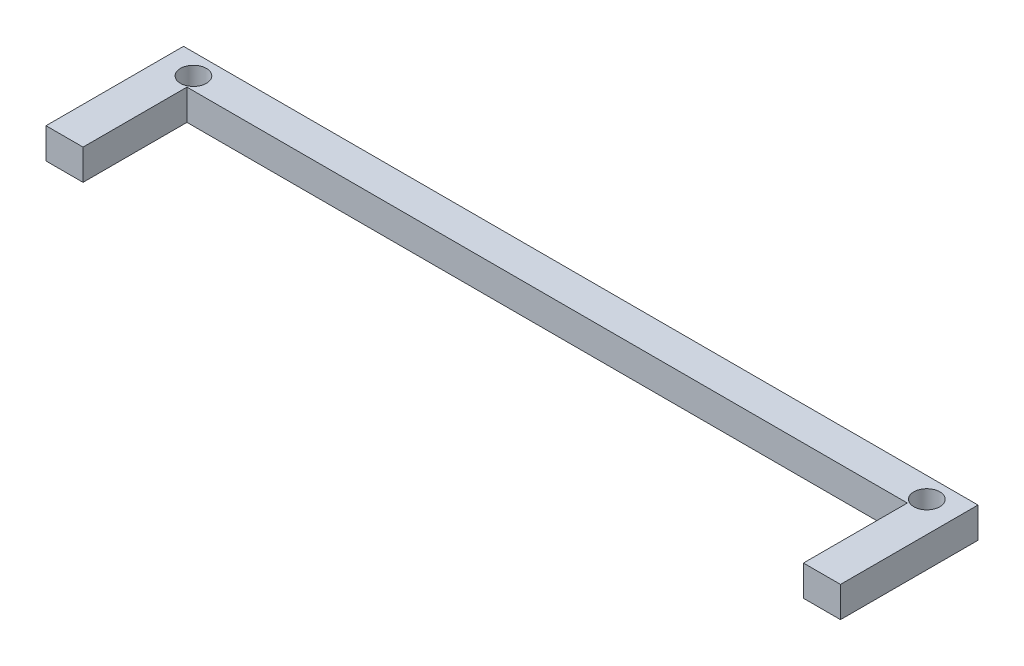
ISO-10303-21;
HEADER;
FILE_DESCRIPTION(('STEP AP214'),'2;1');
FILE_NAME('part.step','',(''),(''),'','','');
FILE_SCHEMA(('AUTOMOTIVE_DESIGN { 1 0 10303 214 1 1 1 1 }'));
ENDSEC;
DATA;
#1=APPLICATION_CONTEXT('core data for automotive mechanical design processes');
#2=APPLICATION_PROTOCOL_DEFINITION('international standard','automotive_design',2000,#1);
#3=PRODUCT_CONTEXT('',#1,'mechanical');
#4=PRODUCT('Part','Part','',(#3));
#5=PRODUCT_RELATED_PRODUCT_CATEGORY('part','',(#4));
#6=PRODUCT_DEFINITION_FORMATION('','',#4);
#7=PRODUCT_DEFINITION_CONTEXT('part definition',#1,'design');
#8=PRODUCT_DEFINITION('design','',#6,#7);
#9=PRODUCT_DEFINITION_SHAPE('','',#8);
#10=(LENGTH_UNIT() NAMED_UNIT(*) SI_UNIT(.MILLI.,.METRE.));
#11=(NAMED_UNIT(*) PLANE_ANGLE_UNIT() SI_UNIT($,.RADIAN.));
#12=(NAMED_UNIT(*) SI_UNIT($,.STERADIAN.) SOLID_ANGLE_UNIT());
#13=UNCERTAINTY_MEASURE_WITH_UNIT(LENGTH_MEASURE(1.E-05),#10,'distance_accuracy_value','');
#14=(GEOMETRIC_REPRESENTATION_CONTEXT(3) GLOBAL_UNCERTAINTY_ASSIGNED_CONTEXT((#13)) GLOBAL_UNIT_ASSIGNED_CONTEXT((#10,
#11,#12)) REPRESENTATION_CONTEXT('',''));
#15=CARTESIAN_POINT('',(0.,0.,0.));
#16=DIRECTION('',(0.,0.,1.));
#17=DIRECTION('',(1.,0.,0.));
#18=AXIS2_PLACEMENT_3D('',#15,#16,#17);
#19=CARTESIAN_POINT('',(0.,10.,0.));
#20=DIRECTION('',(0.,1.,0.));
#21=DIRECTION('',(0.,0.,1.));
#22=AXIS2_PLACEMENT_3D('',#19,#20,#21);
#23=PLANE('',#22);
#24=CARTESIAN_POINT('',(-120.,10.,-4.25));
#25=DIRECTION('',(0.,1.,0.));
#26=DIRECTION('',(0.,0.,1.));
#27=AXIS2_PLACEMENT_3D('',#24,#25,#26);
#28=CIRCLE('',#27,4.25000000000001);
#29=CARTESIAN_POINT('',(-120.,10.,0.));
#30=VERTEX_POINT('',#29);
#31=EDGE_CURVE('E138',#30,#30,#28,.T.);
#32=ORIENTED_EDGE('',*,*,#31,.F.);
#33=EDGE_LOOP('',(#32));
#34=FACE_BOUND('',#33,.T.);
#35=DIRECTION('',(0.,0.,1.));
#36=VECTOR('',#35,1.);
#37=CARTESIAN_POINT('',(-130.,10.,-11.));
#38=LINE('',#37,#36);
#39=CARTESIAN_POINT('',(-130.,10.,-11.));
#40=VERTEX_POINT('',#39);
#41=CARTESIAN_POINT('',(-130.,10.,34.));
#42=VERTEX_POINT('',#41);
#43=EDGE_CURVE('E149',#40,#42,#38,.T.);
#44=ORIENTED_EDGE('',*,*,#43,.T.);
#45=DIRECTION('',(1.,0.,0.));
#46=VECTOR('',#45,1.);
#47=CARTESIAN_POINT('',(-130.,10.,34.));
#48=LINE('',#47,#46);
#49=CARTESIAN_POINT('',(-117.875,10.,34.));
#50=VERTEX_POINT('',#49);
#51=EDGE_CURVE('E96',#42,#50,#48,.T.);
#52=ORIENTED_EDGE('',*,*,#51,.T.);
#53=DIRECTION('',(0.,0.,-1.));
#54=VECTOR('',#53,1.);
#55=CARTESIAN_POINT('',(-117.875,10.,34.));
#56=LINE('',#55,#54);
#57=CARTESIAN_POINT('',(-117.875,10.,0.));
#58=VERTEX_POINT('',#57);
#59=EDGE_CURVE('E164',#50,#58,#56,.T.);
#60=ORIENTED_EDGE('',*,*,#59,.T.);
#61=DIRECTION('',(1.,0.,0.));
#62=VECTOR('',#61,1.);
#63=CARTESIAN_POINT('',(-117.875,10.,0.));
#64=LINE('',#63,#62);
#65=CARTESIAN_POINT('',(117.875,10.,0.));
#66=VERTEX_POINT('',#65);
#67=EDGE_CURVE('E177',#58,#66,#64,.T.);
#68=ORIENTED_EDGE('',*,*,#67,.T.);
#69=DIRECTION('',(0.,0.,1.));
#70=VECTOR('',#69,1.);
#71=CARTESIAN_POINT('',(117.875,10.,34.));
#72=LINE('',#71,#70);
#73=CARTESIAN_POINT('',(117.875,10.,34.));
#74=VERTEX_POINT('',#73);
#75=EDGE_CURVE('E115',#66,#74,#72,.T.);
#76=ORIENTED_EDGE('',*,*,#75,.T.);
#77=DIRECTION('',(1.,0.,0.));
#78=VECTOR('',#77,1.);
#79=CARTESIAN_POINT('',(130.,10.,34.));
#80=LINE('',#79,#78);
#81=CARTESIAN_POINT('',(130.,10.,34.));
#82=VERTEX_POINT('',#81);
#83=EDGE_CURVE('E109',#74,#82,#80,.T.);
#84=ORIENTED_EDGE('',*,*,#83,.T.);
#85=DIRECTION('',(0.,0.,-1.));
#86=VECTOR('',#85,1.);
#87=CARTESIAN_POINT('',(130.,10.,0.));
#88=LINE('',#87,#86);
#89=CARTESIAN_POINT('',(130.,10.,-11.));
#90=VERTEX_POINT('',#89);
#91=EDGE_CURVE('E113',#82,#90,#88,.T.);
#92=ORIENTED_EDGE('',*,*,#91,.T.);
#93=DIRECTION('',(-1.,0.,0.));
#94=VECTOR('',#93,1.);
#95=CARTESIAN_POINT('',(-130.,10.,-11.));
#96=LINE('',#95,#94);
#97=EDGE_CURVE('E54',#90,#40,#96,.T.);
#98=ORIENTED_EDGE('',*,*,#97,.T.);
#99=EDGE_LOOP('',(#44,#52,#60,#68,#76,#84,#92,#98));
#100=FACE_BOUND('',#99,.T.);
#101=CARTESIAN_POINT('',(120.,10.,-4.25));
#102=DIRECTION('',(0.,1.,0.));
#103=DIRECTION('',(0.,0.,-1.));
#104=AXIS2_PLACEMENT_3D('',#101,#102,#103);
#105=CIRCLE('',#104,4.25000000000002);
#106=CARTESIAN_POINT('',(120.,10.,-8.50000000000002));
#107=VERTEX_POINT('',#106);
#108=EDGE_CURVE('E186',#107,#107,#105,.T.);
#109=ORIENTED_EDGE('',*,*,#108,.F.);
#110=EDGE_LOOP('',(#109));
#111=FACE_BOUND('',#110,.T.);
#112=ADVANCED_FACE('F37',(#34,#100,#111),#23,.T.);
#113=CARTESIAN_POINT('',(0.,0.,0.));
#114=DIRECTION('',(0.,1.,0.));
#115=DIRECTION('',(0.,0.,1.));
#116=AXIS2_PLACEMENT_3D('',#113,#114,#115);
#117=PLANE('',#116);
#118=DIRECTION('',(0.,0.,1.));
#119=VECTOR('',#118,1.);
#120=CARTESIAN_POINT('',(-130.,0.,-11.));
#121=LINE('',#120,#119);
#122=CARTESIAN_POINT('',(-130.,0.,-11.));
#123=VERTEX_POINT('',#122);
#124=CARTESIAN_POINT('',(-130.,0.,34.));
#125=VERTEX_POINT('',#124);
#126=EDGE_CURVE('E134',#123,#125,#121,.T.);
#127=ORIENTED_EDGE('',*,*,#126,.F.);
#128=DIRECTION('',(-1.,0.,0.));
#129=VECTOR('',#128,1.);
#130=CARTESIAN_POINT('',(-130.,0.,-11.));
#131=LINE('',#130,#129);
#132=CARTESIAN_POINT('',(130.,0.,-11.));
#133=VERTEX_POINT('',#132);
#134=EDGE_CURVE('E88',#133,#123,#131,.T.);
#135=ORIENTED_EDGE('',*,*,#134,.F.);
#136=DIRECTION('',(0.,0.,-1.));
#137=VECTOR('',#136,1.);
#138=CARTESIAN_POINT('',(130.,0.,-11.));
#139=LINE('',#138,#137);
#140=CARTESIAN_POINT('',(130.,0.,34.));
#141=VERTEX_POINT('',#140);
#142=EDGE_CURVE('E82',#141,#133,#139,.T.);
#143=ORIENTED_EDGE('',*,*,#142,.F.);
#144=DIRECTION('',(1.,0.,0.));
#145=VECTOR('',#144,1.);
#146=CARTESIAN_POINT('',(130.,0.,34.));
#147=LINE('',#146,#145);
#148=CARTESIAN_POINT('',(117.875,0.,34.));
#149=VERTEX_POINT('',#148);
#150=EDGE_CURVE('E124',#149,#141,#147,.T.);
#151=ORIENTED_EDGE('',*,*,#150,.F.);
#152=DIRECTION('',(0.,0.,1.));
#153=VECTOR('',#152,1.);
#154=CARTESIAN_POINT('',(117.875,0.,34.));
#155=LINE('',#154,#153);
#156=CARTESIAN_POINT('',(117.875,0.,0.));
#157=VERTEX_POINT('',#156);
#158=EDGE_CURVE('E144',#157,#149,#155,.T.);
#159=ORIENTED_EDGE('',*,*,#158,.F.);
#160=DIRECTION('',(1.,0.,0.));
#161=VECTOR('',#160,1.);
#162=CARTESIAN_POINT('',(-117.875,0.,0.));
#163=LINE('',#162,#161);
#164=CARTESIAN_POINT('',(-117.875,0.,0.));
#165=VERTEX_POINT('',#164);
#166=EDGE_CURVE('E142',#165,#157,#163,.T.);
#167=ORIENTED_EDGE('',*,*,#166,.F.);
#168=DIRECTION('',(0.,0.,-1.));
#169=VECTOR('',#168,1.);
#170=CARTESIAN_POINT('',(-117.875,0.,34.));
#171=LINE('',#170,#169);
#172=CARTESIAN_POINT('',(-117.875,0.,34.));
#173=VERTEX_POINT('',#172);
#174=EDGE_CURVE('E140',#173,#165,#171,.T.);
#175=ORIENTED_EDGE('',*,*,#174,.F.);
#176=DIRECTION('',(1.,0.,0.));
#177=VECTOR('',#176,1.);
#178=CARTESIAN_POINT('',(-130.,0.,34.));
#179=LINE('',#178,#177);
#180=EDGE_CURVE('E137',#125,#173,#179,.T.);
#181=ORIENTED_EDGE('',*,*,#180,.F.);
#182=EDGE_LOOP('',(#127,#135,#143,#151,#159,#167,#175,#181));
#183=FACE_BOUND('',#182,.T.);
#184=CARTESIAN_POINT('',(-120.,0.,-4.25));
#185=DIRECTION('',(0.,1.,0.));
#186=DIRECTION('',(0.,0.,1.));
#187=AXIS2_PLACEMENT_3D('',#184,#185,#186);
#188=CIRCLE('',#187,4.25000000000001);
#189=CARTESIAN_POINT('',(-120.,0.,0.));
#190=VERTEX_POINT('',#189);
#191=EDGE_CURVE('E183',#190,#190,#188,.T.);
#192=ORIENTED_EDGE('',*,*,#191,.T.);
#193=EDGE_LOOP('',(#192));
#194=FACE_BOUND('',#193,.T.);
#195=CARTESIAN_POINT('',(120.,0.,-4.25));
#196=DIRECTION('',(0.,1.,0.));
#197=DIRECTION('',(0.,0.,-1.));
#198=AXIS2_PLACEMENT_3D('',#195,#196,#197);
#199=CIRCLE('',#198,4.25000000000002);
#200=CARTESIAN_POINT('',(120.,0.,-8.50000000000002));
#201=VERTEX_POINT('',#200);
#202=EDGE_CURVE('E189',#201,#201,#199,.T.);
#203=ORIENTED_EDGE('',*,*,#202,.T.);
#204=EDGE_LOOP('',(#203));
#205=FACE_BOUND('',#204,.T.);
#206=ADVANCED_FACE('F168',(#183,#194,#205),#117,.F.);
#207=CARTESIAN_POINT('',(-130.,10.,-11.));
#208=DIRECTION('',(1.,0.,0.));
#209=DIRECTION('',(0.,0.,-1.));
#210=AXIS2_PLACEMENT_3D('',#207,#208,#209);
#211=PLANE('',#210);
#212=ORIENTED_EDGE('',*,*,#126,.T.);
#213=DIRECTION('',(0.,-1.,0.));
#214=VECTOR('',#213,1.);
#215=CARTESIAN_POINT('',(-130.,10.,34.));
#216=LINE('',#215,#214);
#217=EDGE_CURVE('E11',#42,#125,#216,.T.);
#218=ORIENTED_EDGE('',*,*,#217,.F.);
#219=ORIENTED_EDGE('',*,*,#43,.F.);
#220=DIRECTION('',(0.,-1.,0.));
#221=VECTOR('',#220,1.);
#222=CARTESIAN_POINT('',(-130.,10.,-11.));
#223=LINE('',#222,#221);
#224=EDGE_CURVE('E130',#40,#123,#223,.T.);
#225=ORIENTED_EDGE('',*,*,#224,.T.);
#226=EDGE_LOOP('',(#212,#218,#219,#225));
#227=FACE_BOUND('',#226,.T.);
#228=ADVANCED_FACE('F39',(#227),#211,.F.);
#229=CARTESIAN_POINT('',(-130.,10.,34.));
#230=DIRECTION('',(0.,0.,-1.));
#231=DIRECTION('',(-1.,0.,0.));
#232=AXIS2_PLACEMENT_3D('',#229,#230,#231);
#233=PLANE('',#232);
#234=ORIENTED_EDGE('',*,*,#180,.T.);
#235=DIRECTION('',(0.,-1.,0.));
#236=VECTOR('',#235,1.);
#237=CARTESIAN_POINT('',(-117.875,10.,34.));
#238=LINE('',#237,#236);
#239=EDGE_CURVE('E46',#50,#173,#238,.T.);
#240=ORIENTED_EDGE('',*,*,#239,.F.);
#241=ORIENTED_EDGE('',*,*,#51,.F.);
#242=ORIENTED_EDGE('',*,*,#217,.T.);
#243=EDGE_LOOP('',(#234,#240,#241,#242));
#244=FACE_BOUND('',#243,.T.);
#245=ADVANCED_FACE('F221',(#244),#233,.F.);
#246=CARTESIAN_POINT('',(-117.875,10.,34.));
#247=DIRECTION('',(-1.,0.,0.));
#248=DIRECTION('',(0.,0.,1.));
#249=AXIS2_PLACEMENT_3D('',#246,#247,#248);
#250=PLANE('',#249);
#251=ORIENTED_EDGE('',*,*,#174,.T.);
#252=DIRECTION('',(0.,-1.,0.));
#253=VECTOR('',#252,1.);
#254=CARTESIAN_POINT('',(-117.875,10.,0.));
#255=LINE('',#254,#253);
#256=EDGE_CURVE('E156',#58,#165,#255,.T.);
#257=ORIENTED_EDGE('',*,*,#256,.F.);
#258=ORIENTED_EDGE('',*,*,#59,.F.);
#259=ORIENTED_EDGE('',*,*,#239,.T.);
#260=EDGE_LOOP('',(#251,#257,#258,#259));
#261=FACE_BOUND('',#260,.T.);
#262=ADVANCED_FACE('F162',(#261),#250,.F.);
#263=CARTESIAN_POINT('',(-117.875,10.,0.));
#264=DIRECTION('',(0.,0.,-1.));
#265=DIRECTION('',(-1.,0.,0.));
#266=AXIS2_PLACEMENT_3D('',#263,#264,#265);
#267=PLANE('',#266);
#268=ORIENTED_EDGE('',*,*,#166,.T.);
#269=DIRECTION('',(0.,-1.,0.));
#270=VECTOR('',#269,1.);
#271=CARTESIAN_POINT('',(117.875,10.,0.));
#272=LINE('',#271,#270);
#273=EDGE_CURVE('E153',#66,#157,#272,.T.);
#274=ORIENTED_EDGE('',*,*,#273,.F.);
#275=ORIENTED_EDGE('',*,*,#67,.F.);
#276=ORIENTED_EDGE('',*,*,#256,.T.);
#277=EDGE_LOOP('',(#268,#274,#275,#276));
#278=FACE_BOUND('',#277,.T.);
#279=ADVANCED_FACE('F173',(#278),#267,.F.);
#280=CARTESIAN_POINT('',(117.875,10.,34.));
#281=DIRECTION('',(1.,0.,0.));
#282=DIRECTION('',(0.,0.,-1.));
#283=AXIS2_PLACEMENT_3D('',#280,#281,#282);
#284=PLANE('',#283);
#285=ORIENTED_EDGE('',*,*,#158,.T.);
#286=DIRECTION('',(0.,-1.,0.));
#287=VECTOR('',#286,1.);
#288=CARTESIAN_POINT('',(117.875,10.,34.));
#289=LINE('',#288,#287);
#290=EDGE_CURVE('E125',#74,#149,#289,.T.);
#291=ORIENTED_EDGE('',*,*,#290,.F.);
#292=ORIENTED_EDGE('',*,*,#75,.F.);
#293=ORIENTED_EDGE('',*,*,#273,.T.);
#294=EDGE_LOOP('',(#285,#291,#292,#293));
#295=FACE_BOUND('',#294,.T.);
#296=ADVANCED_FACE('F176',(#295),#284,.F.);
#297=CARTESIAN_POINT('',(130.,10.,34.));
#298=DIRECTION('',(0.,0.,-1.));
#299=DIRECTION('',(-1.,0.,0.));
#300=AXIS2_PLACEMENT_3D('',#297,#298,#299);
#301=PLANE('',#300);
#302=ORIENTED_EDGE('',*,*,#150,.T.);
#303=DIRECTION('',(0.,-1.,0.));
#304=VECTOR('',#303,1.);
#305=CARTESIAN_POINT('',(130.,10.,34.));
#306=LINE('',#305,#304);
#307=EDGE_CURVE('E121',#82,#141,#306,.T.);
#308=ORIENTED_EDGE('',*,*,#307,.F.);
#309=ORIENTED_EDGE('',*,*,#83,.F.);
#310=ORIENTED_EDGE('',*,*,#290,.T.);
#311=EDGE_LOOP('',(#302,#308,#309,#310));
#312=FACE_BOUND('',#311,.T.);
#313=ADVANCED_FACE('F122',(#312),#301,.F.);
#314=CARTESIAN_POINT('',(130.,10.,-11.));
#315=DIRECTION('',(-1.,0.,0.));
#316=DIRECTION('',(0.,0.,1.));
#317=AXIS2_PLACEMENT_3D('',#314,#315,#316);
#318=PLANE('',#317);
#319=ORIENTED_EDGE('',*,*,#142,.T.);
#320=DIRECTION('',(0.,-1.,0.));
#321=VECTOR('',#320,1.);
#322=CARTESIAN_POINT('',(130.,10.,-11.));
#323=LINE('',#322,#321);
#324=EDGE_CURVE('E126',#90,#133,#323,.T.);
#325=ORIENTED_EDGE('',*,*,#324,.F.);
#326=ORIENTED_EDGE('',*,*,#91,.F.);
#327=ORIENTED_EDGE('',*,*,#307,.T.);
#328=EDGE_LOOP('',(#319,#325,#326,#327));
#329=FACE_BOUND('',#328,.T.);
#330=ADVANCED_FACE('F128',(#329),#318,.F.);
#331=CARTESIAN_POINT('',(-130.,10.,-11.));
#332=DIRECTION('',(0.,0.,1.));
#333=DIRECTION('',(1.,0.,0.));
#334=AXIS2_PLACEMENT_3D('',#331,#332,#333);
#335=PLANE('',#334);
#336=ORIENTED_EDGE('',*,*,#134,.T.);
#337=ORIENTED_EDGE('',*,*,#224,.F.);
#338=ORIENTED_EDGE('',*,*,#97,.F.);
#339=ORIENTED_EDGE('',*,*,#324,.T.);
#340=EDGE_LOOP('',(#336,#337,#338,#339));
#341=FACE_BOUND('',#340,.T.);
#342=ADVANCED_FACE('F209',(#341),#335,.F.);
#343=CARTESIAN_POINT('',(-120.,10.,-4.25));
#344=DIRECTION('',(0.,-1.,0.));
#345=DIRECTION('',(0.,0.,-1.));
#346=AXIS2_PLACEMENT_3D('',#343,#344,#345);
#347=CYLINDRICAL_SURFACE('',#346,4.25000000000001);
#348=ORIENTED_EDGE('',*,*,#31,.T.);
#349=EDGE_LOOP('',(#348));
#350=FACE_BOUND('',#349,.T.);
#351=ORIENTED_EDGE('',*,*,#191,.F.);
#352=EDGE_LOOP('',(#351));
#353=FACE_BOUND('',#352,.T.);
#354=ADVANCED_FACE('F206',(#350,#353),#347,.F.);
#355=CARTESIAN_POINT('',(120.,10.,-4.25));
#356=DIRECTION('',(0.,-1.,0.));
#357=DIRECTION('',(0.,0.,-1.));
#358=AXIS2_PLACEMENT_3D('',#355,#356,#357);
#359=CYLINDRICAL_SURFACE('',#358,4.25000000000002);
#360=ORIENTED_EDGE('',*,*,#108,.T.);
#361=EDGE_LOOP('',(#360));
#362=FACE_BOUND('',#361,.T.);
#363=ORIENTED_EDGE('',*,*,#202,.F.);
#364=EDGE_LOOP('',(#363));
#365=FACE_BOUND('',#364,.T.);
#366=ADVANCED_FACE('F195',(#362,#365),#359,.F.);
#367=CLOSED_SHELL('',(#112,#206,#228,#245,#262,#279,#296,#313,#330,#342,#354,#366));
#368=MANIFOLD_SOLID_BREP('B2',#367);
#369=ADVANCED_BREP_SHAPE_REPRESENTATION('',(#18,#368),#14);
#370=SHAPE_DEFINITION_REPRESENTATION(#9,#369);
ENDSEC;
END-ISO-10303-21;
